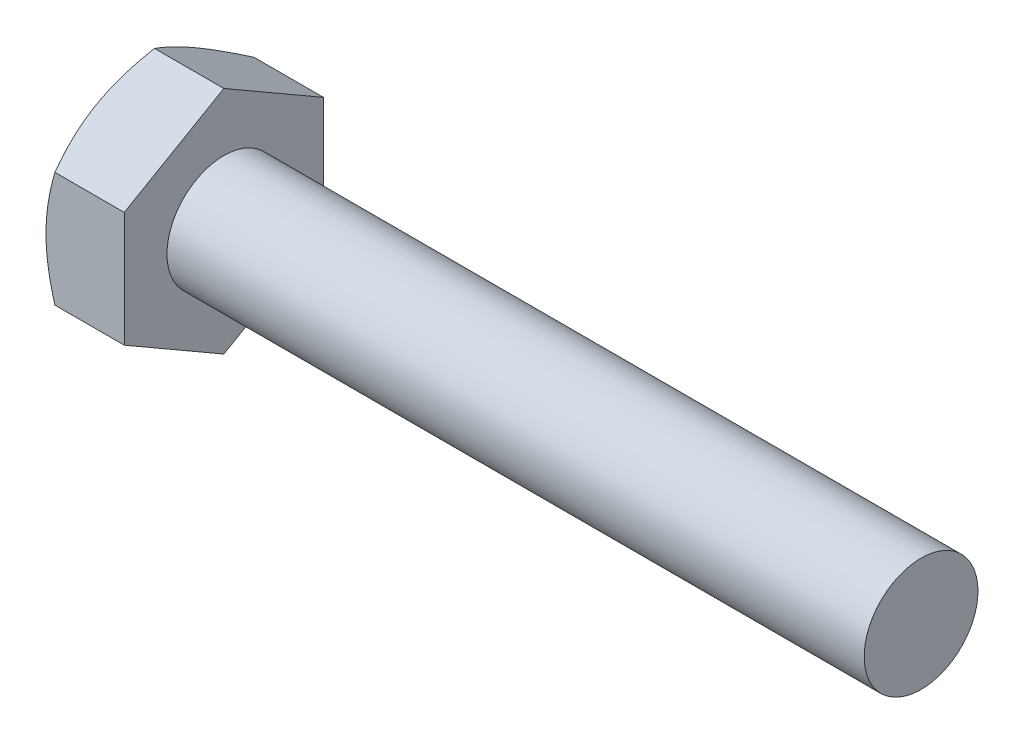
ISO-10303-21;
HEADER;
FILE_DESCRIPTION(('STEP AP214'),'2;1');
FILE_NAME('part.step','',(''),(''),'','','');
FILE_SCHEMA(('AUTOMOTIVE_DESIGN { 1 0 10303 214 1 1 1 1 }'));
ENDSEC;
DATA;
#1=APPLICATION_CONTEXT('core data for automotive mechanical design processes');
#2=APPLICATION_PROTOCOL_DEFINITION('international standard','automotive_design',2000,#1);
#3=PRODUCT_CONTEXT('',#1,'mechanical');
#4=PRODUCT('Part','Part','',(#3));
#5=PRODUCT_RELATED_PRODUCT_CATEGORY('part','',(#4));
#6=PRODUCT_DEFINITION_FORMATION('','',#4);
#7=PRODUCT_DEFINITION_CONTEXT('part definition',#1,'design');
#8=PRODUCT_DEFINITION('design','',#6,#7);
#9=PRODUCT_DEFINITION_SHAPE('','',#8);
#10=(LENGTH_UNIT() NAMED_UNIT(*) SI_UNIT(.MILLI.,.METRE.));
#11=(NAMED_UNIT(*) PLANE_ANGLE_UNIT() SI_UNIT($,.RADIAN.));
#12=(NAMED_UNIT(*) SI_UNIT($,.STERADIAN.) SOLID_ANGLE_UNIT());
#13=UNCERTAINTY_MEASURE_WITH_UNIT(LENGTH_MEASURE(1.E-05),#10,'distance_accuracy_value','');
#14=(GEOMETRIC_REPRESENTATION_CONTEXT(3) GLOBAL_UNCERTAINTY_ASSIGNED_CONTEXT((#13)) GLOBAL_UNIT_ASSIGNED_CONTEXT((#10,
#11,#12)) REPRESENTATION_CONTEXT('',''));
#15=CARTESIAN_POINT('',(0.,0.,0.));
#16=DIRECTION('',(0.,0.,1.));
#17=DIRECTION('',(1.,0.,0.));
#18=AXIS2_PLACEMENT_3D('',#15,#16,#17);
#19=CARTESIAN_POINT('',(-21.6296875,-3.20790243318486,5.55625));
#20=DIRECTION('',(0.,0.,-1.));
#21=DIRECTION('',(0.,1.,0.));
#22=AXIS2_PLACEMENT_3D('',#19,#20,#21);
#23=PLANE('',#22);
#24=CARTESIAN_POINT('',(-18.8562500574616,-8.74399028271725,5.55625));
#25=CARTESIAN_POINT('',(-18.9750226439003,-8.50018624433216,5.55625));
#26=CARTESIAN_POINT('',(-19.0926924877412,-8.25583594838019,5.55625));
#27=CARTESIAN_POINT('',(-19.3252088302931,-7.76575276181024,5.55625));
#28=CARTESIAN_POINT('',(-19.440054907504,-7.52001967143121,5.55625));
#29=CARTESIAN_POINT('',(-19.6668565650906,-7.02567502758555,5.55625));
#30=CARTESIAN_POINT('',(-19.7787940754759,-6.77705515601887,5.55625));
#31=CARTESIAN_POINT('',(-19.9982541438231,-6.27788161359692,5.55625));
#32=CARTESIAN_POINT('',(-20.1057769023311,-6.02732803119865,5.55625));
#33=CARTESIAN_POINT('',(-20.318781896146,-5.51539046667092,5.55625));
#34=CARTESIAN_POINT('',(-20.4240727000269,-5.2539264127266,5.55625));
#35=CARTESIAN_POINT('',(-20.6269889851458,-4.72798657849262,5.55625));
#36=CARTESIAN_POINT('',(-20.7246136244234,-4.46351047103703,5.55625));
#37=CARTESIAN_POINT('',(-20.9097282154484,-3.931581690416,5.55625));
#38=CARTESIAN_POINT('',(-20.9972376154158,-3.66413585057299,5.55625));
#39=CARTESIAN_POINT('',(-21.1593974423586,-3.12540698347402,5.55625));
#40=CARTESIAN_POINT('',(-21.234051786064,-2.85412515234024,5.55625));
#41=CARTESIAN_POINT('',(-21.3666111578849,-2.30908269853906,5.55625));
#42=CARTESIAN_POINT('',(-21.4246096690236,-2.03534517245376,5.55625));
#43=CARTESIAN_POINT('',(-21.5206483322196,-1.48429809984413,5.55625));
#44=CARTESIAN_POINT('',(-21.5586906465641,-1.20698894364918,5.55625));
#45=CARTESIAN_POINT('',(-21.5982678026956,-0.791294728945898,5.55625));
#46=CARTESIAN_POINT('',(-21.608533902021,-0.653708209357044,5.55625));
#47=CARTESIAN_POINT('',(-21.623237187288,-0.378228688137566,5.55625));
#48=CARTESIAN_POINT('',(-21.6276749263983,-0.240335716836749,5.55625));
#49=CARTESIAN_POINT('',(-21.6306104775687,0.0355251316508488,5.55625));
#50=CARTESIAN_POINT('',(-21.6291077727923,0.17349301431098,5.55625));
#51=CARTESIAN_POINT('',(-21.6202015100424,0.449228447033497,5.55625));
#52=CARTESIAN_POINT('',(-21.6127981814189,0.586996004673769,5.55625));
#53=CARTESIAN_POINT('',(-21.5883619355163,0.914267817860302,5.55625));
#54=CARTESIAN_POINT('',(-21.5687422237309,1.10358331302688,5.55625));
#55=CARTESIAN_POINT('',(-21.5194018119308,1.48088314390515,5.55625));
#56=CARTESIAN_POINT('',(-21.4896798473206,1.66886730995275,5.55625));
#57=CARTESIAN_POINT('',(-21.3869305513119,2.23056094001761,5.55625));
#58=CARTESIAN_POINT('',(-21.3003356125147,2.60182550045217,5.55625));
#59=CARTESIAN_POINT('',(-21.1492011053987,3.15725729103479,5.55625));
#60=CARTESIAN_POINT('',(-21.0945336113424,3.34427702524158,5.55625));
#61=CARTESIAN_POINT('',(-20.979281052333,3.71650215163137,5.55625));
#62=CARTESIAN_POINT('',(-20.9186959419117,3.90170752986172,5.55625));
#63=CARTESIAN_POINT('',(-20.7926000457604,4.27035971442928,5.55625));
#64=CARTESIAN_POINT('',(-20.7270906550753,4.45380700235122,5.55625));
#65=CARTESIAN_POINT('',(-20.5919409129719,4.81916376783226,5.55625));
#66=CARTESIAN_POINT('',(-20.5223006552843,5.00107328017707,5.55625));
#67=CARTESIAN_POINT('',(-20.3299083948252,5.48965634412821,5.55625));
#68=CARTESIAN_POINT('',(-20.2039222750788,5.79505516029649,5.55625));
#69=CARTESIAN_POINT('',(-19.9445712832959,6.40271511827116,5.55625));
#70=CARTESIAN_POINT('',(-19.8112055993156,6.7049759104509,5.55625));
#71=CARTESIAN_POINT('',(-19.5388381126131,7.30707795631466,5.55625));
#72=CARTESIAN_POINT('',(-19.3998341769931,7.60691824193361,5.55625));
#73=CARTESIAN_POINT('',(-19.1175353632321,8.20455030388993,5.55625));
#74=CARTESIAN_POINT('',(-18.9742406584325,8.50234216238501,5.55625));
#75=CARTESIAN_POINT('',(-18.684062083384,9.09675870347432,5.55625));
#76=CARTESIAN_POINT('',(-18.5371728378226,9.39338075659061,5.55625));
#77=CARTESIAN_POINT('',(-18.2407164750758,9.98528417706332,5.55625));
#78=CARTESIAN_POINT('',(-18.0911493357868,10.2805655333282,5.55625));
#79=CARTESIAN_POINT('',(-17.6393144244542,11.1646418998589,5.55625));
#80=CARTESIAN_POINT('',(-17.3338479994491,11.7518013892495,5.55625));
#81=CARTESIAN_POINT('',(-16.7497429574185,12.8613257589912,5.55625));
#82=CARTESIAN_POINT('',(-16.4716735829024,13.3839917749348,5.55625));
#83=CARTESIAN_POINT('',(-15.9121764266466,14.4275635287064,5.55625));
#84=CARTESIAN_POINT('',(-15.6307484397935,14.9484691565073,5.55625));
#85=CARTESIAN_POINT('',(-15.0663519924016,15.9871873035495,5.55625));
#86=CARTESIAN_POINT('',(-14.7833918337456,16.5050043408021,5.55625));
#87=CARTESIAN_POINT('',(-14.2155648642822,17.5395393833806,5.55625));
#88=CARTESIAN_POINT('',(-13.9306982052306,18.0562574719669,5.55625));
#89=CARTESIAN_POINT('',(-13.64513735051,18.5725892213169,5.55624999999999));
#90=B_SPLINE_CURVE_WITH_KNOTS('',3,(#24,#25,#26,#27,#28,#29,#30,#31,#32,#33,#34,#35,#36,#37,#38,
#39,#40,#41,#42,#43,#44,#45,#46,#47,#48,#49,#50,#51,#52,#53,#54,#55,#56,#57,#58,#59,#60,#61,#62,
#63,#64,#65,#66,#67,#68,#69,#70,#71,#72,#73,#74,#75,#76,#77,#78,#79,#80,#81,#82,#83,#84,#85,#86,
#87,#88,#89),.UNSPECIFIED.,.F.,.F.,(4,2,2,2,2,2,2,2,2,2,2,2,2,2,2,2,2,2,2,2,2,2,2,2,2,2,2,2,2,2,
2,2,4),(0.,0.813597716445729,1.6273161491936,2.44525275827226,3.26315217028693,4.10866348233596,
4.95426752580813,5.79821771718856,6.64191031370899,7.48077064504382,8.31954006567861,
8.73334238532056,9.14710542821066,9.56090447051725,9.97468742974188,10.545356138106,
11.1160963088497,12.258134229421,12.842619474887,13.4271092116055,14.0114339823823,
14.5957454997084,15.5866951993033,16.5777541467498,17.5691915643883,18.5605889831377,
19.5535724737812,20.5465641644216,22.5321054869692,24.3081902186865,26.0843839782317,
27.8546363211013,29.6247493906644),.UNSPECIFIED.);
#91=CARTESIAN_POINT('',(-21.1334232665182,-3.20790243318486,5.55625));
#92=VERTEX_POINT('',#91);
#93=CARTESIAN_POINT('',(-21.6296875,0.,5.55625));
#94=VERTEX_POINT('',#93);
#95=EDGE_CURVE('E282',#92,#94,#90,.T.);
#96=ORIENTED_EDGE('',*,*,#95,.F.);
#97=DIRECTION('',(1.,0.,0.));
#98=VECTOR('',#97,1.);
#99=CARTESIAN_POINT('',(-21.6296875,-3.20790243318486,5.55625));
#100=LINE('',#99,#98);
#101=CARTESIAN_POINT('',(-17.2640625,-3.20790243318486,5.55625));
#102=VERTEX_POINT('',#101);
#103=EDGE_CURVE('E258',#92,#102,#100,.T.);
#104=ORIENTED_EDGE('',*,*,#103,.T.);
#105=DIRECTION('',(0.,1.,0.));
#106=VECTOR('',#105,1.);
#107=CARTESIAN_POINT('',(-17.2640625,-3.20790243318486,5.55625));
#108=LINE('',#107,#106);
#109=CARTESIAN_POINT('',(-17.2640625,3.20790243318486,5.55625));
#110=VERTEX_POINT('',#109);
#111=EDGE_CURVE('E279',#102,#110,#108,.T.);
#112=ORIENTED_EDGE('',*,*,#111,.T.);
#113=DIRECTION('',(1.,0.,0.));
#114=VECTOR('',#113,1.);
#115=CARTESIAN_POINT('',(-21.6296875,3.20790243318486,5.55625));
#116=LINE('',#115,#114);
#117=CARTESIAN_POINT('',(-21.1334232665182,3.20790243318486,5.55625));
#118=VERTEX_POINT('',#117);
#119=EDGE_CURVE('E242',#118,#110,#116,.T.);
#120=ORIENTED_EDGE('',*,*,#119,.F.);
#121=EDGE_CURVE('E123',#94,#118,#90,.T.);
#122=ORIENTED_EDGE('',*,*,#121,.F.);
#123=EDGE_LOOP('',(#96,#104,#112,#120,#122));
#124=FACE_BOUND('',#123,.T.);
#125=ADVANCED_FACE('F46',(#124),#23,.F.);
#126=CARTESIAN_POINT('',(-21.6296875,3.20790243318486,5.55625));
#127=DIRECTION('',(0.,-0.866025403784439,-0.5));
#128=DIRECTION('',(0.,0.5,-0.866025403784439));
#129=AXIS2_PLACEMENT_3D('',#126,#127,#128);
#130=PLANE('',#129);
#131=CARTESIAN_POINT('',(-21.1333565980518,3.20778696313102,5.55645));
#132=CARTESIAN_POINT('',(-21.1740619396287,3.27830048099898,5.43431700443227));
#133=CARTESIAN_POINT('',(-21.2129199606368,3.34907690760433,5.31172863757365));
#134=CARTESIAN_POINT('',(-21.2864325665754,3.49120454378004,5.06555635055764));
#135=CARTESIAN_POINT('',(-21.3210853381981,3.56255598725623,4.94197202526351));
#136=CARTESIAN_POINT('',(-21.4180556144389,3.7777527611819,4.56924027919934));
#137=CARTESIAN_POINT('',(-21.473211445498,3.92244755263586,4.3186215488105));
#138=CARTESIAN_POINT('',(-21.537888595153,4.13898067940738,3.94357517172046));
#139=CARTESIAN_POINT('',(-21.5563133296374,4.21017202280888,3.82026814788997));
#140=CARTESIAN_POINT('',(-21.5872091337596,4.35287639627881,3.57309692257778));
#141=CARTESIAN_POINT('',(-21.599680729438,4.42438939736052,3.44923277130254));
#142=CARTESIAN_POINT('',(-21.6183524134017,4.56753961185542,3.20128932668298));
#143=CARTESIAN_POINT('',(-21.6245596193166,4.63917659144933,3.07721043832556));
#144=CARTESIAN_POINT('',(-21.6305760825862,4.7825127822332,2.82894487332451));
#145=CARTESIAN_POINT('',(-21.6303855375727,4.85421199143242,2.70475820012895));
#146=CARTESIAN_POINT('',(-21.6210692573071,5.05064720059277,2.36452243746779));
#147=CARTESIAN_POINT('',(-21.6054278403106,5.1753189069971,2.14858470770919));
#148=CARTESIAN_POINT('',(-21.5558275950254,5.42383425573453,1.71814349723526));
#149=CARTESIAN_POINT('',(-21.5218518117333,5.54767702400135,1.50364153044716));
#150=CARTESIAN_POINT('',(-21.4369217499519,5.79669255822861,1.07233397329164));
#151=CARTESIAN_POINT('',(-21.3856076119579,5.92183390122649,0.855582809091896));
#152=CARTESIAN_POINT('',(-21.2691450447076,6.17025031750736,0.425312954659246));
#153=CARTESIAN_POINT('',(-21.2040239741206,6.29352857247572,0.211788753585619));
#154=CARTESIAN_POINT('',(-21.1333565980518,6.41592033642355,-0.000200000000002093));
#155=B_SPLINE_CURVE_WITH_KNOTS('',3,(#131,#132,#133,#134,#135,#136,#137,#138,#139,#140,#141,
#142,#143,#144,#145,#146,#147,#148,#149,#150,#151,#152,#153,#154),.UNSPECIFIED.,.F.,.F.,(4,2,2,
2,2,2,2,2,2,2,2,4),(0.,0.44031690826804,0.880823012040824,1.76366572331169,2.19427472390783,
2.62484566732156,3.05492684132792,3.48499472977669,4.23370964386675,4.98311813377593,
5.74914806559356,6.51367405016873),.UNSPECIFIED.);
#156=CARTESIAN_POINT('',(-21.6296875,4.81185364977729,2.778125));
#157=VERTEX_POINT('',#156);
#158=EDGE_CURVE('E119',#118,#157,#155,.T.);
#159=ORIENTED_EDGE('',*,*,#158,.F.);
#160=ORIENTED_EDGE('',*,*,#119,.T.);
#161=DIRECTION('',(0.,0.5,-0.866025403784439));
#162=VECTOR('',#161,1.);
#163=CARTESIAN_POINT('',(-17.2640625,3.20790243318486,5.55625));
#164=LINE('',#163,#162);
#165=CARTESIAN_POINT('',(-17.2640625,6.41580486636972,0.));
#166=VERTEX_POINT('',#165);
#167=EDGE_CURVE('E277',#110,#166,#164,.T.);
#168=ORIENTED_EDGE('',*,*,#167,.T.);
#169=DIRECTION('',(1.,0.,0.));
#170=VECTOR('',#169,1.);
#171=CARTESIAN_POINT('',(-21.6296875,6.41580486636972,0.));
#172=LINE('',#171,#170);
#173=CARTESIAN_POINT('',(-21.1334232665182,6.41580486636972,0.));
#174=VERTEX_POINT('',#173);
#175=EDGE_CURVE('E144',#174,#166,#172,.T.);
#176=ORIENTED_EDGE('',*,*,#175,.F.);
#177=EDGE_CURVE('E128',#157,#174,#155,.T.);
#178=ORIENTED_EDGE('',*,*,#177,.F.);
#179=EDGE_LOOP('',(#159,#160,#168,#176,#178));
#180=FACE_BOUND('',#179,.T.);
#181=ADVANCED_FACE('F142',(#180),#130,.F.);
#182=CARTESIAN_POINT('',(-21.6296875,6.41580486636972,0.));
#183=DIRECTION('',(0.,-0.866025403784439,0.5));
#184=DIRECTION('',(0.,-0.5,-0.866025403784439));
#185=AXIS2_PLACEMENT_3D('',#182,#183,#184);
#186=PLANE('',#185);
#187=CARTESIAN_POINT('',(-21.1333565980518,6.41592033642355,0.000199999999998099));
#188=CARTESIAN_POINT('',(-21.1740619396287,6.34540681855559,-0.121932995567733));
#189=CARTESIAN_POINT('',(-21.2129199606368,6.27463039195025,-0.244521362426355));
#190=CARTESIAN_POINT('',(-21.2864325665754,6.13250275577453,-0.490693649442358));
#191=CARTESIAN_POINT('',(-21.3210853381981,6.06115131229835,-0.614277974736489));
#192=CARTESIAN_POINT('',(-21.4180556144389,5.84595453837268,-0.987009720800663));
#193=CARTESIAN_POINT('',(-21.473211445498,5.70125974691872,-1.2376284511895));
#194=CARTESIAN_POINT('',(-21.537888595153,5.48472662014719,-1.61267482827954));
#195=CARTESIAN_POINT('',(-21.5563133296374,5.41353527674569,-1.73598185211002));
#196=CARTESIAN_POINT('',(-21.5872091337596,5.27083090327577,-1.98315307742222));
#197=CARTESIAN_POINT('',(-21.599680729438,5.19931790219406,-2.10701722869746));
#198=CARTESIAN_POINT('',(-21.6183524134017,5.05616768769916,-2.35496067331702));
#199=CARTESIAN_POINT('',(-21.6245596193166,4.98453070810525,-2.47903956167444));
#200=CARTESIAN_POINT('',(-21.6305760825862,4.84119451732138,-2.72730512667549));
#201=CARTESIAN_POINT('',(-21.6303855375727,4.76949530812216,-2.85149179987105));
#202=CARTESIAN_POINT('',(-21.6210692573071,4.5730600989618,-3.19172756253221));
#203=CARTESIAN_POINT('',(-21.6054278403106,4.44838839255747,-3.40766529229081));
#204=CARTESIAN_POINT('',(-21.5558275950254,4.19987304382004,-3.83810650276474));
#205=CARTESIAN_POINT('',(-21.5218518117333,4.07603027555323,-4.05260846955284));
#206=CARTESIAN_POINT('',(-21.4369217499519,3.82701474132597,-4.48391602670836));
#207=CARTESIAN_POINT('',(-21.3856076119579,3.70187339832808,-4.7006671909081));
#208=CARTESIAN_POINT('',(-21.2691450447076,3.45345698204721,-5.13093704534075));
#209=CARTESIAN_POINT('',(-21.2040239741206,3.33017872707885,-5.34446124641438));
#210=CARTESIAN_POINT('',(-21.1333565980518,3.20778696313102,-5.55645));
#211=B_SPLINE_CURVE_WITH_KNOTS('',3,(#187,#188,#189,#190,#191,#192,#193,#194,#195,#196,#197,
#198,#199,#200,#201,#202,#203,#204,#205,#206,#207,#208,#209,#210),.UNSPECIFIED.,.F.,.F.,(4,2,2,
2,2,2,2,2,2,2,2,4),(0.,0.44031690826804,0.880823012040822,1.76366572331169,2.19427472390783,
2.62484566732156,3.05492684132792,3.48499472977669,4.23370964386675,4.98311813377593,
5.74914806559356,6.51367405016873),.UNSPECIFIED.);
#212=CARTESIAN_POINT('',(-21.6296875,4.81185364977729,-2.778125));
#213=VERTEX_POINT('',#212);
#214=EDGE_CURVE('E133',#174,#213,#211,.T.);
#215=ORIENTED_EDGE('',*,*,#214,.F.);
#216=ORIENTED_EDGE('',*,*,#175,.T.);
#217=DIRECTION('',(0.,-0.5,-0.866025403784439));
#218=VECTOR('',#217,1.);
#219=CARTESIAN_POINT('',(-17.2640625,6.41580486636972,0.));
#220=LINE('',#219,#218);
#221=CARTESIAN_POINT('',(-17.2640625,3.20790243318486,-5.55625));
#222=VERTEX_POINT('',#221);
#223=EDGE_CURVE('E273',#166,#222,#220,.T.);
#224=ORIENTED_EDGE('',*,*,#223,.T.);
#225=DIRECTION('',(1.,0.,0.));
#226=VECTOR('',#225,1.);
#227=CARTESIAN_POINT('',(-21.6296875,3.20790243318486,-5.55625));
#228=LINE('',#227,#226);
#229=CARTESIAN_POINT('',(-21.1334232665182,3.20790243318486,-5.55625));
#230=VERTEX_POINT('',#229);
#231=EDGE_CURVE('E249',#230,#222,#228,.T.);
#232=ORIENTED_EDGE('',*,*,#231,.F.);
#233=EDGE_CURVE('E147',#213,#230,#211,.T.);
#234=ORIENTED_EDGE('',*,*,#233,.F.);
#235=EDGE_LOOP('',(#215,#216,#224,#232,#234));
#236=FACE_BOUND('',#235,.T.);
#237=ADVANCED_FACE('F208',(#236),#186,.F.);
#238=CARTESIAN_POINT('',(-21.6296875,3.20790243318486,-5.55625));
#239=DIRECTION('',(0.,0.,1.));
#240=DIRECTION('',(0.,-1.,0.));
#241=AXIS2_PLACEMENT_3D('',#238,#239,#240);
#242=PLANE('',#241);
#243=CARTESIAN_POINT('',(-18.8562500598475,-8.74399027782085,-5.55625));
#244=CARTESIAN_POINT('',(-18.9750226461868,-8.50018623960062,-5.55625));
#245=CARTESIAN_POINT('',(-19.0926924899284,-8.25583594381362,-5.55625));
#246=CARTESIAN_POINT('',(-19.325208832282,-7.76575275757412,-5.55625));
#247=CARTESIAN_POINT('',(-19.440054909394,-7.52001966736056,-5.55625));
#248=CARTESIAN_POINT('',(-19.6668565667827,-7.02567502384834,-5.55625));
#249=CARTESIAN_POINT('',(-19.7787940770691,-6.77705515244963,-5.55625));
#250=CARTESIAN_POINT('',(-19.9982541452201,-6.27788161036475,-5.55625));
#251=CARTESIAN_POINT('',(-20.1057769036307,-6.02732802813559,-5.55625));
#252=CARTESIAN_POINT('',(-20.3187818972481,-5.51539046395943,-5.55625));
#253=CARTESIAN_POINT('',(-20.424072701029,-5.25392641019769,-5.55625));
#254=CARTESIAN_POINT('',(-20.6269889859531,-4.72798657633179,-5.55625));
#255=CARTESIAN_POINT('',(-20.7246136251359,-4.4635104690617,-5.55625));
#256=CARTESIAN_POINT('',(-20.9097282159805,-3.93158168881508,-5.55625));
#257=CARTESIAN_POINT('',(-20.9972376158621,-3.66413584916098,-5.55625));
#258=CARTESIAN_POINT('',(-21.1593974426472,-3.12540698244495,-5.55625));
#259=CARTESIAN_POINT('',(-21.2340517862806,-2.8541251515052,-5.55625));
#260=CARTESIAN_POINT('',(-21.3666111579561,-2.30908269819076,-5.55625));
#261=CARTESIAN_POINT('',(-21.4246096690269,-2.03534517239951,-5.55625));
#262=CARTESIAN_POINT('',(-21.5206483321313,-1.4842981003853,-5.55625));
#263=CARTESIAN_POINT('',(-21.5586906464521,-1.20698894449172,-5.55625));
#264=CARTESIAN_POINT('',(-21.5982678025883,-0.791294730238443,-5.55625));
#265=CARTESIAN_POINT('',(-21.6085339019217,-0.653708210797408,-5.55625));
#266=CARTESIAN_POINT('',(-21.6232371872178,-0.378228689873304,-5.55625));
#267=CARTESIAN_POINT('',(-21.6276749263492,-0.24033571872004,-5.55625));
#268=CARTESIAN_POINT('',(-21.6306104775746,0.0355251294734927,-5.55625));
#269=CARTESIAN_POINT('',(-21.6291077728321,0.173493011987113,-5.55625));
#270=CARTESIAN_POINT('',(-21.620201510162,0.449228444418531,-5.55625));
#271=CARTESIAN_POINT('',(-21.6127981815845,0.586996001914216,-5.55625));
#272=CARTESIAN_POINT('',(-21.5883619357947,0.914267814878998,-5.55625));
#273=CARTESIAN_POINT('',(-21.5687422240741,1.10358330996903,-5.55625));
#274=CARTESIAN_POINT('',(-21.519401812407,1.48088314069774,-5.55625));
#275=CARTESIAN_POINT('',(-21.4896798478651,1.66886730667231,-5.55625));
#276=CARTESIAN_POINT('',(-21.3869305520625,2.23056093652212,-5.55625));
#277=CARTESIAN_POINT('',(-21.3003356134045,2.60182549681905,-5.55625));
#278=CARTESIAN_POINT('',(-21.1492011064939,3.15725728719582,-5.55625));
#279=CARTESIAN_POINT('',(-21.0945336125065,3.34427702133249,-5.55625));
#280=CARTESIAN_POINT('',(-20.9792810536328,3.71650214758286,-5.55625));
#281=CARTESIAN_POINT('',(-20.9186959432783,3.9017075257439,-5.55625));
#282=CARTESIAN_POINT('',(-20.7926000472581,4.27035971017337,-5.55625));
#283=CARTESIAN_POINT('',(-20.7270906566373,4.45380699802653,-5.55625));
#284=CARTESIAN_POINT('',(-20.5919409146602,4.81916376337001,-5.55625));
#285=CARTESIAN_POINT('',(-20.5223006570347,5.00107327564603,-5.55625));
#286=CARTESIAN_POINT('',(-20.3299083966823,5.48965633955827,-5.55625));
#287=CARTESIAN_POINT('',(-20.2039222769738,5.7950551557544,-5.55625));
#288=CARTESIAN_POINT('',(-19.9445712852557,6.4027151137812,-5.55625));
#289=CARTESIAN_POINT('',(-19.8112056013023,6.7049759059852,-5.55625));
#290=CARTESIAN_POINT('',(-19.5388381146457,7.3070779518949,-5.55625));
#291=CARTESIAN_POINT('',(-19.3998341790448,7.60691823753553,-5.55625));
#292=CARTESIAN_POINT('',(-19.1175353653161,8.20455029953285,-5.55625));
#293=CARTESIAN_POINT('',(-18.9742406605298,8.50234215804726,-5.55625));
#294=CARTESIAN_POINT('',(-18.6840620855033,9.09675869917466,-5.55625));
#295=CARTESIAN_POINT('',(-18.5371728399505,9.3933807523097,-5.55625));
#296=CARTESIAN_POINT('',(-18.240716477218,9.98528417281851,-5.55625));
#297=CARTESIAN_POINT('',(-18.0911493379345,10.2805655291007,-5.55625));
#298=CARTESIAN_POINT('',(-17.6393144266152,11.1646418956815,-5.55625));
#299=CARTESIAN_POINT('',(-17.3338480016145,11.7518013851031,-5.55625));
#300=CARTESIAN_POINT('',(-16.7497429596005,12.8613257548756,-5.55625));
#301=CARTESIAN_POINT('',(-16.4716735850975,13.3839917708193,-5.55625));
#302=CARTESIAN_POINT('',(-15.912176428865,14.42756352459,-5.55625));
#303=CARTESIAN_POINT('',(-15.6307484420222,14.9484691523898,-5.55625000000001));
#304=CARTESIAN_POINT('',(-15.0663519946515,15.9871872994245,-5.55625000000001));
#305=CARTESIAN_POINT('',(-14.7833918360065,16.5050043366708,-5.55625000000001));
#306=CARTESIAN_POINT('',(-14.2155648665637,17.5395393792358,-5.55625000000001));
#307=CARTESIAN_POINT('',(-13.9306982075218,18.056257467815,-5.55625000000001));
#308=CARTESIAN_POINT('',(-13.6451373528106,18.5725892171576,-5.55625000000001));
#309=B_SPLINE_CURVE_WITH_KNOTS('',3,(#243,#244,#245,#246,#247,#248,#249,#250,#251,#252,#253,
#254,#255,#256,#257,#258,#259,#260,#261,#262,#263,#264,#265,#266,#267,#268,#269,#270,#271,#272,
#273,#274,#275,#276,#277,#278,#279,#280,#281,#282,#283,#284,#285,#286,#287,#288,#289,#290,#291,
#292,#293,#294,#295,#296,#297,#298,#299,#300,#301,#302,#303,#304,#305,#306,#307,#308),
.UNSPECIFIED.,.F.,.F.,(4,2,2,2,2,2,2,2,2,2,2,2,2,2,2,2,2,2,2,2,2,2,2,2,2,2,2,2,2,2,2,2,4),(0.,
0.813597715870461,1.62731614804298,2.4452527565403,3.26315216797367,4.10866347940255,
4.95426752225436,5.79821771301645,6.64191030891902,7.48077063935045,8.31954005908317,
8.73334237828504,9.14710542073519,9.56090446260155,9.97468742138601,10.5453561295019,
11.1160962999972,12.2581342200709,12.8426194652768,13.4271092017353,14.0114339722529,
14.5957454893196,15.5866951889479,16.5777541364282,17.5691915541016,18.5605889728859,
19.5535724635683,20.5465641542476,22.5321054768716,24.308190208571,26.0843839680985,
27.8546363109357,29.624749380466),.UNSPECIFIED.);
#310=CARTESIAN_POINT('',(-21.6296875,0.,-5.55625));
#311=VERTEX_POINT('',#310);
#312=EDGE_CURVE('E202',#230,#311,#309,.F.);
#313=ORIENTED_EDGE('',*,*,#312,.F.);
#314=ORIENTED_EDGE('',*,*,#231,.T.);
#315=DIRECTION('',(0.,-1.,0.));
#316=VECTOR('',#315,1.);
#317=CARTESIAN_POINT('',(-17.2640625,3.20790243318486,-5.55625));
#318=LINE('',#317,#316);
#319=CARTESIAN_POINT('',(-17.2640625,-3.20790243318486,-5.55625));
#320=VERTEX_POINT('',#319);
#321=EDGE_CURVE('E269',#222,#320,#318,.T.);
#322=ORIENTED_EDGE('',*,*,#321,.T.);
#323=DIRECTION('',(1.,0.,0.));
#324=VECTOR('',#323,1.);
#325=CARTESIAN_POINT('',(-21.6296875,-3.20790243318486,-5.55625));
#326=LINE('',#325,#324);
#327=CARTESIAN_POINT('',(-21.1334232665182,-3.20790243318486,-5.55625));
#328=VERTEX_POINT('',#327);
#329=EDGE_CURVE('E252',#328,#320,#326,.T.);
#330=ORIENTED_EDGE('',*,*,#329,.F.);
#331=EDGE_CURVE('E195',#311,#328,#309,.F.);
#332=ORIENTED_EDGE('',*,*,#331,.F.);
#333=EDGE_LOOP('',(#313,#314,#322,#330,#332));
#334=FACE_BOUND('',#333,.T.);
#335=ADVANCED_FACE('F204',(#334),#242,.F.);
#336=CARTESIAN_POINT('',(-21.6296875,-3.20790243318486,-5.55625));
#337=DIRECTION('',(0.,0.866025403784439,0.5));
#338=DIRECTION('',(0.,-0.5,0.866025403784439));
#339=AXIS2_PLACEMENT_3D('',#336,#337,#338);
#340=PLANE('',#339);
#341=CARTESIAN_POINT('',(-21.1333565980518,-3.20778696313102,-5.55645));
#342=CARTESIAN_POINT('',(-21.1740619396287,-3.27830048099899,-5.43431700443227));
#343=CARTESIAN_POINT('',(-21.2129199606368,-3.34907690760433,-5.31172863757365));
#344=CARTESIAN_POINT('',(-21.2864325665754,-3.49120454378004,-5.06555635055764));
#345=CARTESIAN_POINT('',(-21.3210853381981,-3.56255598725623,-4.94197202526351));
#346=CARTESIAN_POINT('',(-21.4180556144389,-3.7777527611819,-4.56924027919934));
#347=CARTESIAN_POINT('',(-21.473211445498,-3.92244755263586,-4.3186215488105));
#348=CARTESIAN_POINT('',(-21.537888595153,-4.13898067940738,-3.94357517172046));
#349=CARTESIAN_POINT('',(-21.5563133296374,-4.21017202280889,-3.82026814788998));
#350=CARTESIAN_POINT('',(-21.5872091337596,-4.35287639627881,-3.57309692257778));
#351=CARTESIAN_POINT('',(-21.599680729438,-4.42438939736052,-3.44923277130254));
#352=CARTESIAN_POINT('',(-21.6183524134017,-4.56753961185542,-3.20128932668298));
#353=CARTESIAN_POINT('',(-21.6245596193166,-4.63917659144933,-3.07721043832556));
#354=CARTESIAN_POINT('',(-21.6305760825862,-4.7825127822332,-2.82894487332451));
#355=CARTESIAN_POINT('',(-21.6303855375727,-4.85421199143242,-2.70475820012895));
#356=CARTESIAN_POINT('',(-21.6210692573071,-5.05064720059278,-2.36452243746779));
#357=CARTESIAN_POINT('',(-21.6054278403106,-5.1753189069971,-2.14858470770919));
#358=CARTESIAN_POINT('',(-21.5558275950254,-5.42383425573454,-1.71814349723526));
#359=CARTESIAN_POINT('',(-21.5218518117333,-5.54767702400135,-1.50364153044716));
#360=CARTESIAN_POINT('',(-21.4369217499519,-5.79669255822861,-1.07233397329164));
#361=CARTESIAN_POINT('',(-21.3856076119579,-5.92183390122649,-0.855582809091897));
#362=CARTESIAN_POINT('',(-21.2691450447076,-6.17025031750737,-0.425312954659247));
#363=CARTESIAN_POINT('',(-21.2040239741206,-6.29352857247572,-0.21178875358562));
#364=CARTESIAN_POINT('',(-21.1333565980518,-6.41592033642356,0.000200000000000749));
#365=B_SPLINE_CURVE_WITH_KNOTS('',3,(#341,#342,#343,#344,#345,#346,#347,#348,#349,#350,#351,
#352,#353,#354,#355,#356,#357,#358,#359,#360,#361,#362,#363,#364),.UNSPECIFIED.,.F.,.F.,(4,2,2,
2,2,2,2,2,2,2,2,4),(0.,0.440316908268042,0.880823012040824,1.76366572331169,2.19427472390783,
2.62484566732156,3.05492684132792,3.4849947297767,4.23370964386675,4.98311813377593,
5.74914806559357,6.51367405016873),.UNSPECIFIED.);
#366=CARTESIAN_POINT('',(-21.6296875,-4.81185364977729,-2.778125));
#367=VERTEX_POINT('',#366);
#368=EDGE_CURVE('E203',#328,#367,#365,.T.);
#369=ORIENTED_EDGE('',*,*,#368,.F.);
#370=ORIENTED_EDGE('',*,*,#329,.T.);
#371=DIRECTION('',(0.,-0.5,0.866025403784439));
#372=VECTOR('',#371,1.);
#373=CARTESIAN_POINT('',(-17.2640625,-3.20790243318486,-5.55625));
#374=LINE('',#373,#372);
#375=CARTESIAN_POINT('',(-17.2640625,-6.41580486636972,0.));
#376=VERTEX_POINT('',#375);
#377=EDGE_CURVE('E265',#320,#376,#374,.T.);
#378=ORIENTED_EDGE('',*,*,#377,.T.);
#379=DIRECTION('',(1.,0.,0.));
#380=VECTOR('',#379,1.);
#381=CARTESIAN_POINT('',(-21.6296875,-6.41580486636972,0.));
#382=LINE('',#381,#380);
#383=CARTESIAN_POINT('',(-21.1334232665182,-6.41580486636972,0.));
#384=VERTEX_POINT('',#383);
#385=EDGE_CURVE('E255',#384,#376,#382,.T.);
#386=ORIENTED_EDGE('',*,*,#385,.F.);
#387=EDGE_CURVE('E189',#367,#384,#365,.T.);
#388=ORIENTED_EDGE('',*,*,#387,.F.);
#389=EDGE_LOOP('',(#369,#370,#378,#386,#388));
#390=FACE_BOUND('',#389,.T.);
#391=ADVANCED_FACE('F207',(#390),#340,.F.);
#392=CARTESIAN_POINT('',(-21.6296875,-6.41580486636972,0.));
#393=DIRECTION('',(0.,0.866025403784439,-0.5));
#394=DIRECTION('',(0.,0.5,0.866025403784439));
#395=AXIS2_PLACEMENT_3D('',#392,#393,#394);
#396=PLANE('',#395);
#397=CARTESIAN_POINT('',(-21.1333565980518,-6.41592033642356,-0.000199999999999715));
#398=CARTESIAN_POINT('',(-21.1740619396287,-6.34540681855559,0.121932995567731));
#399=CARTESIAN_POINT('',(-21.2129199606368,-6.27463039195025,0.244521362426353));
#400=CARTESIAN_POINT('',(-21.2864325665754,-6.13250275577454,0.490693649442356));
#401=CARTESIAN_POINT('',(-21.3210853381981,-6.06115131229835,0.614277974736487));
#402=CARTESIAN_POINT('',(-21.4180556144389,-5.84595453837268,0.987009720800662));
#403=CARTESIAN_POINT('',(-21.473211445498,-5.70125974691872,1.2376284511895));
#404=CARTESIAN_POINT('',(-21.537888595153,-5.48472662014719,1.61267482827954));
#405=CARTESIAN_POINT('',(-21.5563133296374,-5.41353527674569,1.73598185211002));
#406=CARTESIAN_POINT('',(-21.5872091337596,-5.27083090327577,1.98315307742222));
#407=CARTESIAN_POINT('',(-21.599680729438,-5.19931790219406,2.10701722869746));
#408=CARTESIAN_POINT('',(-21.6183524134017,-5.05616768769916,2.35496067331702));
#409=CARTESIAN_POINT('',(-21.6245596193166,-4.98453070810525,2.47903956167444));
#410=CARTESIAN_POINT('',(-21.6305760825862,-4.84119451732138,2.72730512667549));
#411=CARTESIAN_POINT('',(-21.6303855375727,-4.76949530812216,2.85149179987105));
#412=CARTESIAN_POINT('',(-21.6210692573071,-4.5730600989618,3.19172756253221));
#413=CARTESIAN_POINT('',(-21.6054278403106,-4.44838839255747,3.40766529229081));
#414=CARTESIAN_POINT('',(-21.5558275950254,-4.19987304382004,3.83810650276474));
#415=CARTESIAN_POINT('',(-21.5218518117333,-4.07603027555323,4.05260846955284));
#416=CARTESIAN_POINT('',(-21.4369217499519,-3.82701474132597,4.48391602670836));
#417=CARTESIAN_POINT('',(-21.3856076119579,-3.70187339832808,4.7006671909081));
#418=CARTESIAN_POINT('',(-21.2691450447076,-3.45345698204721,5.13093704534075));
#419=CARTESIAN_POINT('',(-21.2040239741206,-3.33017872707885,5.34446124641438));
#420=CARTESIAN_POINT('',(-21.1333565980518,-3.20778696313102,5.55645));
#421=B_SPLINE_CURVE_WITH_KNOTS('',3,(#397,#398,#399,#400,#401,#402,#403,#404,#405,#406,#407,
#408,#409,#410,#411,#412,#413,#414,#415,#416,#417,#418,#419,#420),.UNSPECIFIED.,.F.,.F.,(4,2,2,
2,2,2,2,2,2,2,2,4),(0.,0.44031690826804,0.880823012040823,1.76366572331169,2.19427472390783,
2.62484566732156,3.05492684132792,3.4849947297767,4.23370964386675,4.98311813377593,
5.74914806559356,6.51367405016873),.UNSPECIFIED.);
#422=CARTESIAN_POINT('',(-21.6296875,-4.81185364977729,2.778125));
#423=VERTEX_POINT('',#422);
#424=EDGE_CURVE('E317',#384,#423,#421,.T.);
#425=ORIENTED_EDGE('',*,*,#424,.F.);
#426=ORIENTED_EDGE('',*,*,#385,.T.);
#427=DIRECTION('',(0.,0.5,0.866025403784439));
#428=VECTOR('',#427,1.);
#429=CARTESIAN_POINT('',(-17.2640625,-6.41580486636972,0.));
#430=LINE('',#429,#428);
#431=EDGE_CURVE('E261',#376,#102,#430,.T.);
#432=ORIENTED_EDGE('',*,*,#431,.T.);
#433=ORIENTED_EDGE('',*,*,#103,.F.);
#434=EDGE_CURVE('E139',#423,#92,#421,.T.);
#435=ORIENTED_EDGE('',*,*,#434,.F.);
#436=EDGE_LOOP('',(#425,#426,#432,#433,#435));
#437=FACE_BOUND('',#436,.T.);
#438=ADVANCED_FACE('F231',(#437),#396,.F.);
#439=CARTESIAN_POINT('',(-17.2640625,0.,0.));
#440=DIRECTION('',(1.,0.,0.));
#441=DIRECTION('',(0.,0.,-1.));
#442=AXIS2_PLACEMENT_3D('',#439,#440,#441);
#443=CYLINDRICAL_SURFACE('',#442,3.175);
#444=CARTESIAN_POINT('',(-17.2640625,0.,0.));
#445=DIRECTION('',(-1.,0.,0.));
#446=DIRECTION('',(0.,0.,1.));
#447=AXIS2_PLACEMENT_3D('',#444,#445,#446);
#448=CIRCLE('',#447,3.175);
#449=CARTESIAN_POINT('',(-17.2640625,0.,3.175));
#450=VERTEX_POINT('',#449);
#451=EDGE_CURVE('E238',#450,#450,#448,.F.);
#452=ORIENTED_EDGE('',*,*,#451,.T.);
#453=EDGE_LOOP('',(#452));
#454=FACE_BOUND('',#453,.T.);
#455=CARTESIAN_POINT('',(21.6296875,0.,0.));
#456=DIRECTION('',(1.,0.,0.));
#457=DIRECTION('',(0.,0.,-1.));
#458=AXIS2_PLACEMENT_3D('',#455,#456,#457);
#459=CIRCLE('',#458,3.175);
#460=CARTESIAN_POINT('',(21.6296875,0.,-3.175));
#461=VERTEX_POINT('',#460);
#462=EDGE_CURVE('E235',#461,#461,#459,.T.);
#463=ORIENTED_EDGE('',*,*,#462,.F.);
#464=EDGE_LOOP('',(#463));
#465=FACE_BOUND('',#464,.T.);
#466=ADVANCED_FACE('F48',(#454,#465),#443,.T.);
#467=CARTESIAN_POINT('',(21.6296875,0.,0.));
#468=DIRECTION('',(1.,0.,0.));
#469=DIRECTION('',(0.,0.,-1.));
#470=AXIS2_PLACEMENT_3D('',#467,#468,#469);
#471=PLANE('',#470);
#472=ORIENTED_EDGE('',*,*,#462,.T.);
#473=EDGE_LOOP('',(#472));
#474=FACE_BOUND('',#473,.T.);
#475=ADVANCED_FACE('F224',(#474),#471,.T.);
#476=CARTESIAN_POINT('',(-17.2640625,3.20790243318486,5.55625));
#477=DIRECTION('',(-1.,0.,0.));
#478=DIRECTION('',(0.,0.,1.));
#479=AXIS2_PLACEMENT_3D('',#476,#477,#478);
#480=PLANE('',#479);
#481=ORIENTED_EDGE('',*,*,#451,.F.);
#482=EDGE_LOOP('',(#481));
#483=FACE_BOUND('',#482,.T.);
#484=ORIENTED_EDGE('',*,*,#111,.F.);
#485=ORIENTED_EDGE('',*,*,#431,.F.);
#486=ORIENTED_EDGE('',*,*,#377,.F.);
#487=ORIENTED_EDGE('',*,*,#321,.F.);
#488=ORIENTED_EDGE('',*,*,#223,.F.);
#489=ORIENTED_EDGE('',*,*,#167,.F.);
#490=EDGE_LOOP('',(#484,#485,#486,#487,#488,#489));
#491=FACE_BOUND('',#490,.T.);
#492=ADVANCED_FACE('F174',(#483,#491),#480,.F.);
#493=CARTESIAN_POINT('',(-21.6296875,0.,0.));
#494=DIRECTION('',(1.,0.,0.));
#495=DIRECTION('',(0.,0.,1.));
#496=AXIS2_PLACEMENT_3D('',#493,#494,#495);
#497=CONICAL_SURFACE('',#496,5.55625,1.0471975511966);
#498=ORIENTED_EDGE('',*,*,#95,.T.);
#499=CARTESIAN_POINT('',(-21.6296875,0.,0.));
#500=DIRECTION('',(-1.,0.,0.));
#501=DIRECTION('',(0.,0.,1.));
#502=AXIS2_PLACEMENT_3D('',#499,#500,#501);
#503=CIRCLE('',#502,5.55625);
#504=EDGE_CURVE('E50',#423,#94,#503,.T.);
#505=ORIENTED_EDGE('',*,*,#504,.F.);
#506=ORIENTED_EDGE('',*,*,#434,.T.);
#507=EDGE_LOOP('',(#498,#505,#506));
#508=FACE_BOUND('',#507,.T.);
#509=ADVANCED_FACE('F169',(#508),#497,.T.);
#510=ORIENTED_EDGE('',*,*,#387,.T.);
#511=ORIENTED_EDGE('',*,*,#424,.T.);
#512=EDGE_CURVE('E71',#367,#423,#503,.T.);
#513=ORIENTED_EDGE('',*,*,#512,.F.);
#514=EDGE_LOOP('',(#510,#511,#513));
#515=FACE_BOUND('',#514,.T.);
#516=ADVANCED_FACE('F173',(#515),#497,.T.);
#517=ORIENTED_EDGE('',*,*,#331,.T.);
#518=ORIENTED_EDGE('',*,*,#368,.T.);
#519=EDGE_CURVE('E307',#311,#367,#503,.T.);
#520=ORIENTED_EDGE('',*,*,#519,.F.);
#521=EDGE_LOOP('',(#517,#518,#520));
#522=FACE_BOUND('',#521,.T.);
#523=ADVANCED_FACE('F308',(#522),#497,.T.);
#524=ORIENTED_EDGE('',*,*,#233,.T.);
#525=ORIENTED_EDGE('',*,*,#312,.T.);
#526=EDGE_CURVE('E56',#213,#311,#503,.T.);
#527=ORIENTED_EDGE('',*,*,#526,.F.);
#528=EDGE_LOOP('',(#524,#525,#527));
#529=FACE_BOUND('',#528,.T.);
#530=ADVANCED_FACE('F304',(#529),#497,.T.);
#531=ORIENTED_EDGE('',*,*,#177,.T.);
#532=ORIENTED_EDGE('',*,*,#214,.T.);
#533=EDGE_CURVE('E12',#157,#213,#503,.T.);
#534=ORIENTED_EDGE('',*,*,#533,.F.);
#535=EDGE_LOOP('',(#531,#532,#534));
#536=FACE_BOUND('',#535,.T.);
#537=ADVANCED_FACE('F131',(#536),#497,.T.);
#538=ORIENTED_EDGE('',*,*,#121,.T.);
#539=ORIENTED_EDGE('',*,*,#158,.T.);
#540=CARTESIAN_POINT('',(-21.6296875,0.,0.));
#541=DIRECTION('',(-1.,0.,0.));
#542=DIRECTION('',(0.,0.,1.));
#543=AXIS2_PLACEMENT_3D('',#540,#541,#542);
#544=CIRCLE('',#543,5.55625);
#545=EDGE_CURVE('E63',#94,#157,#544,.T.);
#546=ORIENTED_EDGE('',*,*,#545,.F.);
#547=EDGE_LOOP('',(#538,#539,#546));
#548=FACE_BOUND('',#547,.T.);
#549=ADVANCED_FACE('F121',(#548),#497,.T.);
#550=CARTESIAN_POINT('',(-21.6296875,3.20790243318486,5.55625));
#551=DIRECTION('',(-1.,0.,0.));
#552=DIRECTION('',(0.,0.,1.));
#553=AXIS2_PLACEMENT_3D('',#550,#551,#552);
#554=PLANE('',#553);
#555=ORIENTED_EDGE('',*,*,#504,.T.);
#556=ORIENTED_EDGE('',*,*,#545,.T.);
#557=ORIENTED_EDGE('',*,*,#533,.T.);
#558=ORIENTED_EDGE('',*,*,#526,.T.);
#559=ORIENTED_EDGE('',*,*,#519,.T.);
#560=ORIENTED_EDGE('',*,*,#512,.T.);
#561=EDGE_LOOP('',(#555,#556,#557,#558,#559,#560));
#562=FACE_BOUND('',#561,.T.);
#563=ADVANCED_FACE('F137',(#562),#554,.T.);
#564=CLOSED_SHELL('',(#125,#181,#237,#335,#391,#438,#466,#475,#492,#509,#516,#523,#530,#537,
#549,#563));
#565=MANIFOLD_SOLID_BREP('B2',#564);
#566=ADVANCED_BREP_SHAPE_REPRESENTATION('',(#18,#565),#14);
#567=SHAPE_DEFINITION_REPRESENTATION(#9,#566);
ENDSEC;
END-ISO-10303-21;
